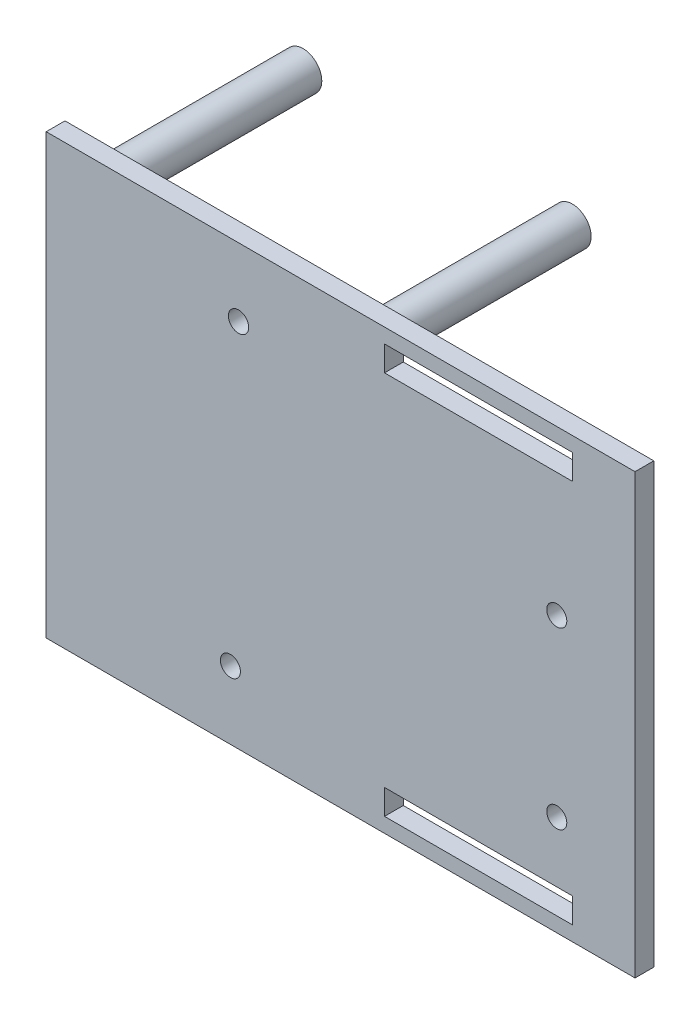
ISO-10303-21;
HEADER;
FILE_DESCRIPTION(('STEP AP214'),'2;1');
FILE_NAME('part.step','',(''),(''),'','','');
FILE_SCHEMA(('AUTOMOTIVE_DESIGN { 1 0 10303 214 1 1 1 1 }'));
ENDSEC;
DATA;
#1=APPLICATION_CONTEXT('core data for automotive mechanical design processes');
#2=APPLICATION_PROTOCOL_DEFINITION('international standard','automotive_design',2000,#1);
#3=PRODUCT_CONTEXT('',#1,'mechanical');
#4=PRODUCT('Part','Part','',(#3));
#5=PRODUCT_RELATED_PRODUCT_CATEGORY('part','',(#4));
#6=PRODUCT_DEFINITION_FORMATION('','',#4);
#7=PRODUCT_DEFINITION_CONTEXT('part definition',#1,'design');
#8=PRODUCT_DEFINITION('design','',#6,#7);
#9=PRODUCT_DEFINITION_SHAPE('','',#8);
#10=(LENGTH_UNIT() NAMED_UNIT(*) SI_UNIT(.MILLI.,.METRE.));
#11=(NAMED_UNIT(*) PLANE_ANGLE_UNIT() SI_UNIT($,.RADIAN.));
#12=(NAMED_UNIT(*) SI_UNIT($,.STERADIAN.) SOLID_ANGLE_UNIT());
#13=UNCERTAINTY_MEASURE_WITH_UNIT(LENGTH_MEASURE(1.E-05),#10,'distance_accuracy_value','');
#14=(GEOMETRIC_REPRESENTATION_CONTEXT(3) GLOBAL_UNCERTAINTY_ASSIGNED_CONTEXT((#13)) GLOBAL_UNIT_ASSIGNED_CONTEXT((#10,
#11,#12)) REPRESENTATION_CONTEXT('',''));
#15=CARTESIAN_POINT('',(0.,0.,0.));
#16=DIRECTION('',(0.,0.,1.));
#17=DIRECTION('',(1.,0.,0.));
#18=AXIS2_PLACEMENT_3D('',#15,#16,#17);
#19=CARTESIAN_POINT('',(0.,0.,3.));
#20=DIRECTION('',(1.,0.,0.));
#21=DIRECTION('',(0.,0.,-1.));
#22=AXIS2_PLACEMENT_3D('',#19,#20,#21);
#23=PLANE('',#22);
#24=DIRECTION('',(0.,-1.,0.));
#25=VECTOR('',#24,1.);
#26=CARTESIAN_POINT('',(0.,0.,0.));
#27=LINE('',#26,#25);
#28=CARTESIAN_POINT('',(0.,70.,0.));
#29=VERTEX_POINT('',#28);
#30=CARTESIAN_POINT('',(0.,0.,0.));
#31=VERTEX_POINT('',#30);
#32=EDGE_CURVE('E211',#29,#31,#27,.T.);
#33=ORIENTED_EDGE('',*,*,#32,.T.);
#34=DIRECTION('',(0.,0.,-1.));
#35=VECTOR('',#34,1.);
#36=CARTESIAN_POINT('',(0.,0.,3.));
#37=LINE('',#36,#35);
#38=CARTESIAN_POINT('',(0.,0.,3.));
#39=VERTEX_POINT('',#38);
#40=EDGE_CURVE('E238',#39,#31,#37,.T.);
#41=ORIENTED_EDGE('',*,*,#40,.F.);
#42=DIRECTION('',(0.,-1.,0.));
#43=VECTOR('',#42,1.);
#44=CARTESIAN_POINT('',(0.,0.,3.));
#45=LINE('',#44,#43);
#46=CARTESIAN_POINT('',(0.,70.,3.));
#47=VERTEX_POINT('',#46);
#48=EDGE_CURVE('E212',#47,#39,#45,.T.);
#49=ORIENTED_EDGE('',*,*,#48,.F.);
#50=DIRECTION('',(0.,0.,-1.));
#51=VECTOR('',#50,1.);
#52=CARTESIAN_POINT('',(0.,70.,3.));
#53=LINE('',#52,#51);
#54=EDGE_CURVE('E222',#47,#29,#53,.T.);
#55=ORIENTED_EDGE('',*,*,#54,.T.);
#56=EDGE_LOOP('',(#33,#41,#49,#55));
#57=FACE_BOUND('',#56,.T.);
#58=ADVANCED_FACE('F32',(#57),#23,.F.);
#59=CARTESIAN_POINT('',(0.,0.,3.));
#60=DIRECTION('',(0.,1.,0.));
#61=DIRECTION('',(0.,0.,1.));
#62=AXIS2_PLACEMENT_3D('',#59,#60,#61);
#63=PLANE('',#62);
#64=DIRECTION('',(1.,0.,0.));
#65=VECTOR('',#64,1.);
#66=CARTESIAN_POINT('',(0.,0.,0.));
#67=LINE('',#66,#65);
#68=CARTESIAN_POINT('',(94.,0.,0.));
#69=VERTEX_POINT('',#68);
#70=EDGE_CURVE('E225',#31,#69,#67,.T.);
#71=ORIENTED_EDGE('',*,*,#70,.T.);
#72=DIRECTION('',(0.,0.,-1.));
#73=VECTOR('',#72,1.);
#74=CARTESIAN_POINT('',(94.,0.,3.));
#75=LINE('',#74,#73);
#76=CARTESIAN_POINT('',(94.,0.,3.));
#77=VERTEX_POINT('',#76);
#78=EDGE_CURVE('E235',#77,#69,#75,.T.);
#79=ORIENTED_EDGE('',*,*,#78,.F.);
#80=DIRECTION('',(1.,0.,0.));
#81=VECTOR('',#80,1.);
#82=CARTESIAN_POINT('',(0.,0.,3.));
#83=LINE('',#82,#81);
#84=EDGE_CURVE('E215',#39,#77,#83,.T.);
#85=ORIENTED_EDGE('',*,*,#84,.F.);
#86=ORIENTED_EDGE('',*,*,#40,.T.);
#87=EDGE_LOOP('',(#71,#79,#85,#86));
#88=FACE_BOUND('',#87,.T.);
#89=ADVANCED_FACE('F295',(#88),#63,.F.);
#90=CARTESIAN_POINT('',(94.,0.,3.));
#91=DIRECTION('',(-1.,0.,0.));
#92=DIRECTION('',(0.,0.,1.));
#93=AXIS2_PLACEMENT_3D('',#90,#91,#92);
#94=PLANE('',#93);
#95=DIRECTION('',(0.,1.,0.));
#96=VECTOR('',#95,1.);
#97=CARTESIAN_POINT('',(94.,0.,0.));
#98=LINE('',#97,#96);
#99=CARTESIAN_POINT('',(94.,70.,0.));
#100=VERTEX_POINT('',#99);
#101=EDGE_CURVE('E227',#69,#100,#98,.T.);
#102=ORIENTED_EDGE('',*,*,#101,.T.);
#103=DIRECTION('',(0.,0.,-1.));
#104=VECTOR('',#103,1.);
#105=CARTESIAN_POINT('',(94.,70.,3.));
#106=LINE('',#105,#104);
#107=CARTESIAN_POINT('',(94.,70.,3.));
#108=VERTEX_POINT('',#107);
#109=EDGE_CURVE('E232',#108,#100,#106,.T.);
#110=ORIENTED_EDGE('',*,*,#109,.F.);
#111=DIRECTION('',(0.,1.,0.));
#112=VECTOR('',#111,1.);
#113=CARTESIAN_POINT('',(94.,0.,3.));
#114=LINE('',#113,#112);
#115=EDGE_CURVE('E218',#77,#108,#114,.T.);
#116=ORIENTED_EDGE('',*,*,#115,.F.);
#117=ORIENTED_EDGE('',*,*,#78,.T.);
#118=EDGE_LOOP('',(#102,#110,#116,#117));
#119=FACE_BOUND('',#118,.T.);
#120=ADVANCED_FACE('F300',(#119),#94,.F.);
#121=CARTESIAN_POINT('',(0.,70.,3.));
#122=DIRECTION('',(0.,-1.,0.));
#123=DIRECTION('',(0.,0.,-1.));
#124=AXIS2_PLACEMENT_3D('',#121,#122,#123);
#125=PLANE('',#124);
#126=DIRECTION('',(-1.,0.,0.));
#127=VECTOR('',#126,1.);
#128=CARTESIAN_POINT('',(0.,70.,0.));
#129=LINE('',#128,#127);
#130=EDGE_CURVE('E216',#100,#29,#129,.T.);
#131=ORIENTED_EDGE('',*,*,#130,.T.);
#132=ORIENTED_EDGE('',*,*,#54,.F.);
#133=DIRECTION('',(-1.,0.,0.));
#134=VECTOR('',#133,1.);
#135=CARTESIAN_POINT('',(0.,70.,3.));
#136=LINE('',#135,#134);
#137=EDGE_CURVE('E220',#108,#47,#136,.T.);
#138=ORIENTED_EDGE('',*,*,#137,.F.);
#139=ORIENTED_EDGE('',*,*,#109,.T.);
#140=EDGE_LOOP('',(#131,#132,#138,#139));
#141=FACE_BOUND('',#140,.T.);
#142=ADVANCED_FACE('F315',(#141),#125,.F.);
#143=CARTESIAN_POINT('',(0.,0.,3.));
#144=DIRECTION('',(0.,0.,-1.));
#145=DIRECTION('',(-1.,0.,0.));
#146=AXIS2_PLACEMENT_3D('',#143,#144,#145);
#147=PLANE('',#146);
#148=DIRECTION('',(0.,-1.,0.));
#149=VECTOR('',#148,1.);
#150=CARTESIAN_POINT('',(54.0082035372518,0.,3.));
#151=LINE('',#150,#149);
#152=CARTESIAN_POINT('',(54.0082035372518,67.6658056264682,3.));
#153=VERTEX_POINT('',#152);
#154=CARTESIAN_POINT('',(54.0082035372518,63.6658056264682,3.));
#155=VERTEX_POINT('',#154);
#156=EDGE_CURVE('E136',#153,#155,#151,.T.);
#157=ORIENTED_EDGE('',*,*,#156,.F.);
#158=DIRECTION('',(-1.,0.,0.));
#159=VECTOR('',#158,1.);
#160=CARTESIAN_POINT('',(0.,67.6658056264682,3.));
#161=LINE('',#160,#159);
#162=CARTESIAN_POINT('',(84.0082035372518,67.6658056264682,3.));
#163=VERTEX_POINT('',#162);
#164=EDGE_CURVE('E46',#163,#153,#161,.T.);
#165=ORIENTED_EDGE('',*,*,#164,.F.);
#166=DIRECTION('',(0.,1.,0.));
#167=VECTOR('',#166,1.);
#168=CARTESIAN_POINT('',(84.0082035372518,0.,3.));
#169=LINE('',#168,#167);
#170=CARTESIAN_POINT('',(84.0082035372518,63.6658056264682,3.));
#171=VERTEX_POINT('',#170);
#172=EDGE_CURVE('E143',#171,#163,#169,.T.);
#173=ORIENTED_EDGE('',*,*,#172,.F.);
#174=DIRECTION('',(-1.,0.,0.));
#175=VECTOR('',#174,1.);
#176=CARTESIAN_POINT('',(0.,63.6658056264682,3.));
#177=LINE('',#176,#175);
#178=EDGE_CURVE('E126',#171,#155,#177,.T.);
#179=ORIENTED_EDGE('',*,*,#178,.T.);
#180=EDGE_LOOP('',(#157,#165,#173,#179));
#181=FACE_BOUND('',#180,.T.);
#182=DIRECTION('',(0.,-1.,0.));
#183=VECTOR('',#182,1.);
#184=CARTESIAN_POINT('',(54.0082035372518,1.87378597142809E-13,3.));
#185=LINE('',#184,#183);
#186=CARTESIAN_POINT('',(54.0082035372518,6.35000000000001,3.));
#187=VERTEX_POINT('',#186);
#188=CARTESIAN_POINT('',(54.0082035372518,2.35000000000001,3.));
#189=VERTEX_POINT('',#188);
#190=EDGE_CURVE('E168',#187,#189,#185,.T.);
#191=ORIENTED_EDGE('',*,*,#190,.F.);
#192=DIRECTION('',(-1.,0.,0.));
#193=VECTOR('',#192,1.);
#194=CARTESIAN_POINT('',(0.,6.35000000000001,3.));
#195=LINE('',#194,#193);
#196=CARTESIAN_POINT('',(84.0082035372518,6.35000000000001,3.));
#197=VERTEX_POINT('',#196);
#198=EDGE_CURVE('E54',#197,#187,#195,.T.);
#199=ORIENTED_EDGE('',*,*,#198,.F.);
#200=DIRECTION('',(0.,-1.,0.));
#201=VECTOR('',#200,1.);
#202=CARTESIAN_POINT('',(84.0082035372518,2.91462005701417E-13,3.));
#203=LINE('',#202,#201);
#204=CARTESIAN_POINT('',(84.0082035372518,2.35000000000001,3.));
#205=VERTEX_POINT('',#204);
#206=EDGE_CURVE('E155',#197,#205,#203,.T.);
#207=ORIENTED_EDGE('',*,*,#206,.T.);
#208=DIRECTION('',(-1.,0.,0.));
#209=VECTOR('',#208,1.);
#210=CARTESIAN_POINT('',(0.,2.35000000000001,3.));
#211=LINE('',#210,#209);
#212=EDGE_CURVE('E165',#205,#189,#211,.T.);
#213=ORIENTED_EDGE('',*,*,#212,.T.);
#214=EDGE_LOOP('',(#191,#199,#207,#213));
#215=FACE_BOUND('',#214,.T.);
#216=CARTESIAN_POINT('',(29.4082035372501,10.85,3.));
#217=DIRECTION('',(0.,0.,1.));
#218=DIRECTION('',(1.,0.,0.));
#219=AXIS2_PLACEMENT_3D('',#216,#217,#218);
#220=CIRCLE('',#219,1.6);
#221=CARTESIAN_POINT('',(31.0082035372501,10.85,3.));
#222=VERTEX_POINT('',#221);
#223=EDGE_CURVE('E162',#222,#222,#220,.T.);
#224=ORIENTED_EDGE('',*,*,#223,.F.);
#225=EDGE_LOOP('',(#224));
#226=FACE_BOUND('',#225,.T.);
#227=CARTESIAN_POINT('',(81.5082035372501,15.9981645168826,3.));
#228=DIRECTION('',(0.,0.,1.));
#229=DIRECTION('',(1.,0.,0.));
#230=AXIS2_PLACEMENT_3D('',#227,#228,#229);
#231=CIRCLE('',#230,1.6);
#232=CARTESIAN_POINT('',(83.1082035372501,15.9981645168826,3.));
#233=VERTEX_POINT('',#232);
#234=EDGE_CURVE('E174',#233,#233,#231,.T.);
#235=ORIENTED_EDGE('',*,*,#234,.F.);
#236=EDGE_LOOP('',(#235));
#237=FACE_BOUND('',#236,.T.);
#238=CARTESIAN_POINT('',(81.50820353725,43.9,3.));
#239=DIRECTION('',(0.,0.,1.));
#240=DIRECTION('',(1.,0.,0.));
#241=AXIS2_PLACEMENT_3D('',#238,#239,#240);
#242=CIRCLE('',#241,1.60000000000001);
#243=CARTESIAN_POINT('',(83.10820353725,43.9,3.));
#244=VERTEX_POINT('',#243);
#245=EDGE_CURVE('E177',#244,#244,#242,.T.);
#246=ORIENTED_EDGE('',*,*,#245,.F.);
#247=EDGE_LOOP('',(#246));
#248=FACE_BOUND('',#247,.T.);
#249=CARTESIAN_POINT('',(30.70820353725,59.1,3.));
#250=DIRECTION('',(0.,0.,1.));
#251=DIRECTION('',(1.,0.,0.));
#252=AXIS2_PLACEMENT_3D('',#249,#250,#251);
#253=CIRCLE('',#252,1.61924476262096);
#254=CARTESIAN_POINT('',(32.327448299871,59.1,3.));
#255=VERTEX_POINT('',#254);
#256=EDGE_CURVE('E180',#255,#255,#253,.T.);
#257=ORIENTED_EDGE('',*,*,#256,.F.);
#258=EDGE_LOOP('',(#257));
#259=FACE_BOUND('',#258,.T.);
#260=ORIENTED_EDGE('',*,*,#48,.T.);
#261=ORIENTED_EDGE('',*,*,#84,.T.);
#262=ORIENTED_EDGE('',*,*,#115,.T.);
#263=ORIENTED_EDGE('',*,*,#137,.T.);
#264=EDGE_LOOP('',(#260,#261,#262,#263));
#265=FACE_BOUND('',#264,.T.);
#266=ADVANCED_FACE('F140',(#181,#215,#226,#237,#248,#259,#265),#147,.F.);
#267=CARTESIAN_POINT('',(0.,0.,0.));
#268=DIRECTION('',(0.,0.,-1.));
#269=DIRECTION('',(-1.,0.,0.));
#270=AXIS2_PLACEMENT_3D('',#267,#268,#269);
#271=PLANE('',#270);
#272=DIRECTION('',(1.,0.,0.));
#273=VECTOR('',#272,1.);
#274=CARTESIAN_POINT('',(0.,67.6658056264682,0.));
#275=LINE('',#274,#273);
#276=CARTESIAN_POINT('',(54.0082035372518,67.6658056264682,0.));
#277=VERTEX_POINT('',#276);
#278=CARTESIAN_POINT('',(84.0082035372518,67.6658056264682,0.));
#279=VERTEX_POINT('',#278);
#280=EDGE_CURVE('E11',#277,#279,#275,.T.);
#281=ORIENTED_EDGE('',*,*,#280,.F.);
#282=DIRECTION('',(0.,1.,0.));
#283=VECTOR('',#282,1.);
#284=CARTESIAN_POINT('',(54.0082035372518,0.,0.));
#285=LINE('',#284,#283);
#286=CARTESIAN_POINT('',(54.0082035372518,63.6658056264682,0.));
#287=VERTEX_POINT('',#286);
#288=EDGE_CURVE('E270',#287,#277,#285,.T.);
#289=ORIENTED_EDGE('',*,*,#288,.F.);
#290=DIRECTION('',(1.,0.,0.));
#291=VECTOR('',#290,1.);
#292=CARTESIAN_POINT('',(0.,63.6658056264682,0.));
#293=LINE('',#292,#291);
#294=CARTESIAN_POINT('',(84.0082035372518,63.6658056264682,0.));
#295=VERTEX_POINT('',#294);
#296=EDGE_CURVE('E129',#287,#295,#293,.T.);
#297=ORIENTED_EDGE('',*,*,#296,.T.);
#298=DIRECTION('',(0.,-1.,0.));
#299=VECTOR('',#298,1.);
#300=CARTESIAN_POINT('',(84.0082035372518,0.,0.));
#301=LINE('',#300,#299);
#302=EDGE_CURVE('E39',#279,#295,#301,.T.);
#303=ORIENTED_EDGE('',*,*,#302,.F.);
#304=EDGE_LOOP('',(#281,#289,#297,#303));
#305=FACE_BOUND('',#304,.T.);
#306=DIRECTION('',(1.,0.,0.));
#307=VECTOR('',#306,1.);
#308=CARTESIAN_POINT('',(0.,6.35000000000001,0.));
#309=LINE('',#308,#307);
#310=CARTESIAN_POINT('',(54.0082035372518,6.35000000000001,0.));
#311=VERTEX_POINT('',#310);
#312=CARTESIAN_POINT('',(84.0082035372518,6.35000000000001,0.));
#313=VERTEX_POINT('',#312);
#314=EDGE_CURVE('E268',#311,#313,#309,.T.);
#315=ORIENTED_EDGE('',*,*,#314,.F.);
#316=DIRECTION('',(0.,1.,0.));
#317=VECTOR('',#316,1.);
#318=CARTESIAN_POINT('',(54.0082035372518,1.87378597142809E-13,0.));
#319=LINE('',#318,#317);
#320=CARTESIAN_POINT('',(54.0082035372518,2.35000000000001,0.));
#321=VERTEX_POINT('',#320);
#322=EDGE_CURVE('E250',#321,#311,#319,.T.);
#323=ORIENTED_EDGE('',*,*,#322,.F.);
#324=DIRECTION('',(1.,0.,0.));
#325=VECTOR('',#324,1.);
#326=CARTESIAN_POINT('',(0.,2.35000000000001,0.));
#327=LINE('',#326,#325);
#328=CARTESIAN_POINT('',(84.0082035372518,2.35000000000001,0.));
#329=VERTEX_POINT('',#328);
#330=EDGE_CURVE('E262',#321,#329,#327,.T.);
#331=ORIENTED_EDGE('',*,*,#330,.T.);
#332=DIRECTION('',(0.,1.,0.));
#333=VECTOR('',#332,1.);
#334=CARTESIAN_POINT('',(84.0082035372518,2.91462005701417E-13,0.));
#335=LINE('',#334,#333);
#336=EDGE_CURVE('E265',#329,#313,#335,.T.);
#337=ORIENTED_EDGE('',*,*,#336,.T.);
#338=EDGE_LOOP('',(#315,#323,#331,#337));
#339=FACE_BOUND('',#338,.T.);
#340=CARTESIAN_POINT('',(29.4082035372501,10.85,0.));
#341=DIRECTION('',(0.,0.,-1.));
#342=DIRECTION('',(-1.,0.,0.));
#343=AXIS2_PLACEMENT_3D('',#340,#341,#342);
#344=CIRCLE('',#343,1.6);
#345=CARTESIAN_POINT('',(27.8082035372501,10.85,0.));
#346=VERTEX_POINT('',#345);
#347=EDGE_CURVE('E190',#346,#346,#344,.T.);
#348=ORIENTED_EDGE('',*,*,#347,.F.);
#349=EDGE_LOOP('',(#348));
#350=FACE_BOUND('',#349,.T.);
#351=CARTESIAN_POINT('',(81.5082035372501,15.9981645168826,0.));
#352=DIRECTION('',(0.,0.,-1.));
#353=DIRECTION('',(-1.,0.,0.));
#354=AXIS2_PLACEMENT_3D('',#351,#352,#353);
#355=CIRCLE('',#354,1.6);
#356=CARTESIAN_POINT('',(79.9082035372501,15.9981645168826,0.));
#357=VERTEX_POINT('',#356);
#358=EDGE_CURVE('E256',#357,#357,#355,.T.);
#359=ORIENTED_EDGE('',*,*,#358,.F.);
#360=EDGE_LOOP('',(#359));
#361=FACE_BOUND('',#360,.T.);
#362=CARTESIAN_POINT('',(81.50820353725,43.9,0.));
#363=DIRECTION('',(0.,0.,-1.));
#364=DIRECTION('',(-1.,0.,0.));
#365=AXIS2_PLACEMENT_3D('',#362,#363,#364);
#366=CIRCLE('',#365,1.60000000000001);
#367=CARTESIAN_POINT('',(79.90820353725,43.9,0.));
#368=VERTEX_POINT('',#367);
#369=EDGE_CURVE('E253',#368,#368,#366,.T.);
#370=ORIENTED_EDGE('',*,*,#369,.F.);
#371=EDGE_LOOP('',(#370));
#372=FACE_BOUND('',#371,.T.);
#373=CARTESIAN_POINT('',(30.70820353725,59.1,0.));
#374=DIRECTION('',(0.,0.,-1.));
#375=DIRECTION('',(-1.,0.,0.));
#376=AXIS2_PLACEMENT_3D('',#373,#374,#375);
#377=CIRCLE('',#376,1.61924476262096);
#378=CARTESIAN_POINT('',(29.0889587746291,59.1,0.));
#379=VERTEX_POINT('',#378);
#380=EDGE_CURVE('E150',#379,#379,#377,.T.);
#381=ORIENTED_EDGE('',*,*,#380,.F.);
#382=EDGE_LOOP('',(#381));
#383=FACE_BOUND('',#382,.T.);
#384=CARTESIAN_POINT('',(6.00000000000001,64.,0.));
#385=DIRECTION('',(0.,0.,-1.));
#386=DIRECTION('',(-1.,0.,0.));
#387=AXIS2_PLACEMENT_3D('',#384,#385,#386);
#388=CIRCLE('',#387,3.);
#389=CARTESIAN_POINT('',(3.00000000000001,64.,0.));
#390=VERTEX_POINT('',#389);
#391=EDGE_CURVE('E247',#390,#390,#388,.T.);
#392=ORIENTED_EDGE('',*,*,#391,.F.);
#393=EDGE_LOOP('',(#392));
#394=FACE_BOUND('',#393,.T.);
#395=CARTESIAN_POINT('',(49.,64.,0.));
#396=DIRECTION('',(0.,0.,-1.));
#397=DIRECTION('',(-1.,0.,0.));
#398=AXIS2_PLACEMENT_3D('',#395,#396,#397);
#399=CIRCLE('',#398,3.);
#400=CARTESIAN_POINT('',(46.,64.,0.));
#401=VERTEX_POINT('',#400);
#402=EDGE_CURVE('E244',#401,#401,#399,.T.);
#403=ORIENTED_EDGE('',*,*,#402,.F.);
#404=EDGE_LOOP('',(#403));
#405=FACE_BOUND('',#404,.T.);
#406=CARTESIAN_POINT('',(49.,5.99999999999999,0.));
#407=DIRECTION('',(0.,0.,-1.));
#408=DIRECTION('',(-1.,0.,0.));
#409=AXIS2_PLACEMENT_3D('',#406,#407,#408);
#410=CIRCLE('',#409,3.);
#411=CARTESIAN_POINT('',(46.,5.99999999999999,0.));
#412=VERTEX_POINT('',#411);
#413=EDGE_CURVE('E241',#412,#412,#410,.T.);
#414=ORIENTED_EDGE('',*,*,#413,.F.);
#415=EDGE_LOOP('',(#414));
#416=FACE_BOUND('',#415,.T.);
#417=ORIENTED_EDGE('',*,*,#32,.F.);
#418=ORIENTED_EDGE('',*,*,#130,.F.);
#419=ORIENTED_EDGE('',*,*,#101,.F.);
#420=ORIENTED_EDGE('',*,*,#70,.F.);
#421=EDGE_LOOP('',(#417,#418,#419,#420));
#422=FACE_BOUND('',#421,.T.);
#423=ADVANCED_FACE('F278',(#305,#339,#350,#361,#372,#383,#394,#405,#416,#422),#271,.T.);
#424=CARTESIAN_POINT('',(49.,5.99999999999999,-32.));
#425=DIRECTION('',(0.,0.,1.));
#426=DIRECTION('',(1.,0.,0.));
#427=AXIS2_PLACEMENT_3D('',#424,#425,#426);
#428=CYLINDRICAL_SURFACE('',#427,3.);
#429=ORIENTED_EDGE('',*,*,#413,.T.);
#430=EDGE_LOOP('',(#429));
#431=FACE_BOUND('',#430,.T.);
#432=CARTESIAN_POINT('',(49.,5.99999999999999,-32.));
#433=DIRECTION('',(0.,0.,1.));
#434=DIRECTION('',(1.,0.,0.));
#435=AXIS2_PLACEMENT_3D('',#432,#433,#434);
#436=CIRCLE('',#435,3.);
#437=CARTESIAN_POINT('',(52.,5.99999999999999,-32.));
#438=VERTEX_POINT('',#437);
#439=EDGE_CURVE('E208',#438,#438,#436,.T.);
#440=ORIENTED_EDGE('',*,*,#439,.T.);
#441=EDGE_LOOP('',(#440));
#442=FACE_BOUND('',#441,.T.);
#443=ADVANCED_FACE('F326',(#431,#442),#428,.T.);
#444=CARTESIAN_POINT('',(49.,5.99999999999999,-32.));
#445=DIRECTION('',(0.,0.,1.));
#446=DIRECTION('',(1.,0.,0.));
#447=AXIS2_PLACEMENT_3D('',#444,#445,#446);
#448=PLANE('',#447);
#449=CARTESIAN_POINT('',(49.,5.99999999999999,-32.));
#450=DIRECTION('',(0.,0.,-1.));
#451=DIRECTION('',(-1.,0.,0.));
#452=AXIS2_PLACEMENT_3D('',#449,#450,#451);
#453=CIRCLE('',#452,1.6026276289191);
#454=CARTESIAN_POINT('',(47.3973723710809,5.99999999999999,-32.));
#455=VERTEX_POINT('',#454);
#456=EDGE_CURVE('E194',#455,#455,#453,.T.);
#457=ORIENTED_EDGE('',*,*,#456,.F.);
#458=EDGE_LOOP('',(#457));
#459=FACE_BOUND('',#458,.T.);
#460=ORIENTED_EDGE('',*,*,#439,.F.);
#461=EDGE_LOOP('',(#460));
#462=FACE_BOUND('',#461,.T.);
#463=ADVANCED_FACE('F331',(#459,#462),#448,.F.);
#464=CARTESIAN_POINT('',(49.,64.,-32.));
#465=DIRECTION('',(0.,0.,1.));
#466=DIRECTION('',(1.,0.,0.));
#467=AXIS2_PLACEMENT_3D('',#464,#465,#466);
#468=CYLINDRICAL_SURFACE('',#467,3.);
#469=ORIENTED_EDGE('',*,*,#402,.T.);
#470=EDGE_LOOP('',(#469));
#471=FACE_BOUND('',#470,.T.);
#472=CARTESIAN_POINT('',(49.,64.,-32.));
#473=DIRECTION('',(0.,0.,1.));
#474=DIRECTION('',(1.,0.,0.));
#475=AXIS2_PLACEMENT_3D('',#472,#473,#474);
#476=CIRCLE('',#475,3.);
#477=CARTESIAN_POINT('',(52.,64.,-32.));
#478=VERTEX_POINT('',#477);
#479=EDGE_CURVE('E205',#478,#478,#476,.T.);
#480=ORIENTED_EDGE('',*,*,#479,.T.);
#481=EDGE_LOOP('',(#480));
#482=FACE_BOUND('',#481,.T.);
#483=ADVANCED_FACE('F335',(#471,#482),#468,.T.);
#484=CARTESIAN_POINT('',(49.,64.,-32.));
#485=DIRECTION('',(0.,0.,1.));
#486=DIRECTION('',(1.,0.,0.));
#487=AXIS2_PLACEMENT_3D('',#484,#485,#486);
#488=PLANE('',#487);
#489=CARTESIAN_POINT('',(49.,64.,-32.));
#490=DIRECTION('',(0.,0.,-1.));
#491=DIRECTION('',(-1.,0.,0.));
#492=AXIS2_PLACEMENT_3D('',#489,#490,#491);
#493=CIRCLE('',#492,1.6);
#494=CARTESIAN_POINT('',(47.4,64.,-32.));
#495=VERTEX_POINT('',#494);
#496=EDGE_CURVE('E187',#495,#495,#493,.T.);
#497=ORIENTED_EDGE('',*,*,#496,.F.);
#498=EDGE_LOOP('',(#497));
#499=FACE_BOUND('',#498,.T.);
#500=ORIENTED_EDGE('',*,*,#479,.F.);
#501=EDGE_LOOP('',(#500));
#502=FACE_BOUND('',#501,.T.);
#503=ADVANCED_FACE('F339',(#499,#502),#488,.F.);
#504=CARTESIAN_POINT('',(6.00000000000001,64.,-32.));
#505=DIRECTION('',(0.,0.,1.));
#506=DIRECTION('',(1.,0.,0.));
#507=AXIS2_PLACEMENT_3D('',#504,#505,#506);
#508=CYLINDRICAL_SURFACE('',#507,3.);
#509=ORIENTED_EDGE('',*,*,#391,.T.);
#510=EDGE_LOOP('',(#509));
#511=FACE_BOUND('',#510,.T.);
#512=CARTESIAN_POINT('',(6.00000000000001,64.,-32.));
#513=DIRECTION('',(0.,0.,1.));
#514=DIRECTION('',(1.,0.,0.));
#515=AXIS2_PLACEMENT_3D('',#512,#513,#514);
#516=CIRCLE('',#515,3.);
#517=CARTESIAN_POINT('',(9.00000000000001,64.,-32.));
#518=VERTEX_POINT('',#517);
#519=EDGE_CURVE('E200',#518,#518,#516,.T.);
#520=ORIENTED_EDGE('',*,*,#519,.T.);
#521=EDGE_LOOP('',(#520));
#522=FACE_BOUND('',#521,.T.);
#523=ADVANCED_FACE('F343',(#511,#522),#508,.T.);
#524=CARTESIAN_POINT('',(6.00000000000001,64.,-32.));
#525=DIRECTION('',(0.,0.,1.));
#526=DIRECTION('',(1.,0.,0.));
#527=AXIS2_PLACEMENT_3D('',#524,#525,#526);
#528=PLANE('',#527);
#529=CARTESIAN_POINT('',(6.00000000000001,64.,-32.));
#530=DIRECTION('',(0.,0.,-1.));
#531=DIRECTION('',(-1.,0.,0.));
#532=AXIS2_PLACEMENT_3D('',#529,#530,#531);
#533=CIRCLE('',#532,1.6);
#534=CARTESIAN_POINT('',(4.4,64.,-32.));
#535=VERTEX_POINT('',#534);
#536=EDGE_CURVE('E186',#535,#535,#533,.T.);
#537=ORIENTED_EDGE('',*,*,#536,.F.);
#538=EDGE_LOOP('',(#537));
#539=FACE_BOUND('',#538,.T.);
#540=ORIENTED_EDGE('',*,*,#519,.F.);
#541=EDGE_LOOP('',(#540));
#542=FACE_BOUND('',#541,.T.);
#543=ADVANCED_FACE('F347',(#539,#542),#528,.F.);
#544=CARTESIAN_POINT('',(49.,5.99999999999999,-27.));
#545=DIRECTION('',(0.,0.,-1.));
#546=DIRECTION('',(-1.,0.,0.));
#547=AXIS2_PLACEMENT_3D('',#544,#545,#546);
#548=CYLINDRICAL_SURFACE('',#547,1.6026276289191);
#549=CARTESIAN_POINT('',(49.,5.99999999999999,-27.));
#550=DIRECTION('',(0.,0.,-1.));
#551=DIRECTION('',(-1.,0.,0.));
#552=AXIS2_PLACEMENT_3D('',#549,#550,#551);
#553=CIRCLE('',#552,1.6026276289191);
#554=CARTESIAN_POINT('',(47.3973723710809,5.99999999999999,-27.));
#555=VERTEX_POINT('',#554);
#556=EDGE_CURVE('E197',#555,#555,#553,.T.);
#557=ORIENTED_EDGE('',*,*,#556,.F.);
#558=EDGE_LOOP('',(#557));
#559=FACE_BOUND('',#558,.T.);
#560=ORIENTED_EDGE('',*,*,#456,.T.);
#561=EDGE_LOOP('',(#560));
#562=FACE_BOUND('',#561,.T.);
#563=ADVANCED_FACE('F351',(#559,#562),#548,.F.);
#564=CARTESIAN_POINT('',(49.,5.99999999999999,-27.));
#565=DIRECTION('',(0.,0.,-1.));
#566=DIRECTION('',(-1.,0.,0.));
#567=AXIS2_PLACEMENT_3D('',#564,#565,#566);
#568=PLANE('',#567);
#569=ORIENTED_EDGE('',*,*,#556,.T.);
#570=EDGE_LOOP('',(#569));
#571=FACE_BOUND('',#570,.T.);
#572=ADVANCED_FACE('F355',(#571),#568,.T.);
#573=CARTESIAN_POINT('',(6.00000000000001,64.,-27.));
#574=DIRECTION('',(0.,0.,-1.));
#575=DIRECTION('',(-1.,0.,0.));
#576=AXIS2_PLACEMENT_3D('',#573,#574,#575);
#577=CYLINDRICAL_SURFACE('',#576,1.6);
#578=CARTESIAN_POINT('',(6.00000000000001,64.,-27.));
#579=DIRECTION('',(0.,0.,-1.));
#580=DIRECTION('',(-1.,0.,0.));
#581=AXIS2_PLACEMENT_3D('',#578,#579,#580);
#582=CIRCLE('',#581,1.6);
#583=CARTESIAN_POINT('',(4.4,64.,-27.));
#584=VERTEX_POINT('',#583);
#585=EDGE_CURVE('E191',#584,#584,#582,.T.);
#586=ORIENTED_EDGE('',*,*,#585,.F.);
#587=EDGE_LOOP('',(#586));
#588=FACE_BOUND('',#587,.T.);
#589=ORIENTED_EDGE('',*,*,#536,.T.);
#590=EDGE_LOOP('',(#589));
#591=FACE_BOUND('',#590,.T.);
#592=ADVANCED_FACE('F359',(#588,#591),#577,.F.);
#593=CARTESIAN_POINT('',(6.00000000000001,64.,-27.));
#594=DIRECTION('',(0.,0.,-1.));
#595=DIRECTION('',(-1.,0.,0.));
#596=AXIS2_PLACEMENT_3D('',#593,#594,#595);
#597=PLANE('',#596);
#598=ORIENTED_EDGE('',*,*,#585,.T.);
#599=EDGE_LOOP('',(#598));
#600=FACE_BOUND('',#599,.T.);
#601=ADVANCED_FACE('F363',(#600),#597,.T.);
#602=CARTESIAN_POINT('',(49.,64.,-27.));
#603=DIRECTION('',(0.,0.,-1.));
#604=DIRECTION('',(-1.,0.,0.));
#605=AXIS2_PLACEMENT_3D('',#602,#603,#604);
#606=CYLINDRICAL_SURFACE('',#605,1.6);
#607=CARTESIAN_POINT('',(49.,64.,-27.));
#608=DIRECTION('',(0.,0.,-1.));
#609=DIRECTION('',(-1.,0.,0.));
#610=AXIS2_PLACEMENT_3D('',#607,#608,#609);
#611=CIRCLE('',#610,1.6);
#612=CARTESIAN_POINT('',(47.4,64.,-27.));
#613=VERTEX_POINT('',#612);
#614=EDGE_CURVE('E183',#613,#613,#611,.T.);
#615=ORIENTED_EDGE('',*,*,#614,.F.);
#616=EDGE_LOOP('',(#615));
#617=FACE_BOUND('',#616,.T.);
#618=ORIENTED_EDGE('',*,*,#496,.T.);
#619=EDGE_LOOP('',(#618));
#620=FACE_BOUND('',#619,.T.);
#621=ADVANCED_FACE('F367',(#617,#620),#606,.F.);
#622=CARTESIAN_POINT('',(49.,64.,-27.));
#623=DIRECTION('',(0.,0.,-1.));
#624=DIRECTION('',(-1.,0.,0.));
#625=AXIS2_PLACEMENT_3D('',#622,#623,#624);
#626=PLANE('',#625);
#627=ORIENTED_EDGE('',*,*,#614,.T.);
#628=EDGE_LOOP('',(#627));
#629=FACE_BOUND('',#628,.T.);
#630=ADVANCED_FACE('F371',(#629),#626,.T.);
#631=CARTESIAN_POINT('',(30.70820353725,59.1,-2.));
#632=DIRECTION('',(0.,0.,1.));
#633=DIRECTION('',(1.,0.,0.));
#634=AXIS2_PLACEMENT_3D('',#631,#632,#633);
#635=CYLINDRICAL_SURFACE('',#634,1.61924476262096);
#636=ORIENTED_EDGE('',*,*,#380,.T.);
#637=EDGE_LOOP('',(#636));
#638=FACE_BOUND('',#637,.T.);
#639=ORIENTED_EDGE('',*,*,#256,.T.);
#640=EDGE_LOOP('',(#639));
#641=FACE_BOUND('',#640,.T.);
#642=ADVANCED_FACE('F375',(#638,#641),#635,.F.);
#643=CARTESIAN_POINT('',(81.50820353725,43.9,-2.));
#644=DIRECTION('',(0.,0.,1.));
#645=DIRECTION('',(1.,0.,0.));
#646=AXIS2_PLACEMENT_3D('',#643,#644,#645);
#647=CYLINDRICAL_SURFACE('',#646,1.60000000000001);
#648=ORIENTED_EDGE('',*,*,#369,.T.);
#649=EDGE_LOOP('',(#648));
#650=FACE_BOUND('',#649,.T.);
#651=ORIENTED_EDGE('',*,*,#245,.T.);
#652=EDGE_LOOP('',(#651));
#653=FACE_BOUND('',#652,.T.);
#654=ADVANCED_FACE('F379',(#650,#653),#647,.F.);
#655=CARTESIAN_POINT('',(81.5082035372501,15.9981645168826,-2.));
#656=DIRECTION('',(0.,0.,1.));
#657=DIRECTION('',(1.,0.,0.));
#658=AXIS2_PLACEMENT_3D('',#655,#656,#657);
#659=CYLINDRICAL_SURFACE('',#658,1.6);
#660=ORIENTED_EDGE('',*,*,#358,.T.);
#661=EDGE_LOOP('',(#660));
#662=FACE_BOUND('',#661,.T.);
#663=ORIENTED_EDGE('',*,*,#234,.T.);
#664=EDGE_LOOP('',(#663));
#665=FACE_BOUND('',#664,.T.);
#666=ADVANCED_FACE('F383',(#662,#665),#659,.F.);
#667=CARTESIAN_POINT('',(29.4082035372501,10.85,-2.));
#668=DIRECTION('',(0.,0.,1.));
#669=DIRECTION('',(1.,0.,0.));
#670=AXIS2_PLACEMENT_3D('',#667,#668,#669);
#671=CYLINDRICAL_SURFACE('',#670,1.6);
#672=ORIENTED_EDGE('',*,*,#347,.T.);
#673=EDGE_LOOP('',(#672));
#674=FACE_BOUND('',#673,.T.);
#675=ORIENTED_EDGE('',*,*,#223,.T.);
#676=EDGE_LOOP('',(#675));
#677=FACE_BOUND('',#676,.T.);
#678=ADVANCED_FACE('F387',(#674,#677),#671,.F.);
#679=CARTESIAN_POINT('',(0.,6.35000000000001,-2.));
#680=DIRECTION('',(0.,1.,0.));
#681=DIRECTION('',(0.,0.,1.));
#682=AXIS2_PLACEMENT_3D('',#679,#680,#681);
#683=PLANE('',#682);
#684=ORIENTED_EDGE('',*,*,#314,.T.);
#685=DIRECTION('',(0.,0.,1.));
#686=VECTOR('',#685,1.);
#687=CARTESIAN_POINT('',(84.0082035372518,6.35000000000001,-2.));
#688=LINE('',#687,#686);
#689=EDGE_CURVE('E160',#313,#197,#688,.T.);
#690=ORIENTED_EDGE('',*,*,#689,.T.);
#691=ORIENTED_EDGE('',*,*,#198,.T.);
#692=DIRECTION('',(0.,0.,1.));
#693=VECTOR('',#692,1.);
#694=CARTESIAN_POINT('',(54.0082035372518,6.35000000000001,-2.));
#695=LINE('',#694,#693);
#696=EDGE_CURVE('E153',#311,#187,#695,.T.);
#697=ORIENTED_EDGE('',*,*,#696,.F.);
#698=EDGE_LOOP('',(#684,#690,#691,#697));
#699=FACE_BOUND('',#698,.T.);
#700=ADVANCED_FACE('F391',(#699),#683,.F.);
#701=CARTESIAN_POINT('',(84.0082035372518,2.91462005701417E-13,-2.));
#702=DIRECTION('',(-1.,0.,0.));
#703=DIRECTION('',(0.,-1.,0.));
#704=AXIS2_PLACEMENT_3D('',#701,#702,#703);
#705=PLANE('',#704);
#706=DIRECTION('',(0.,0.,1.));
#707=VECTOR('',#706,1.);
#708=CARTESIAN_POINT('',(84.0082035372518,2.35000000000001,-2.));
#709=LINE('',#708,#707);
#710=EDGE_CURVE('E158',#329,#205,#709,.T.);
#711=ORIENTED_EDGE('',*,*,#710,.T.);
#712=ORIENTED_EDGE('',*,*,#206,.F.);
#713=ORIENTED_EDGE('',*,*,#689,.F.);
#714=ORIENTED_EDGE('',*,*,#336,.F.);
#715=EDGE_LOOP('',(#711,#712,#713,#714));
#716=FACE_BOUND('',#715,.T.);
#717=ADVANCED_FACE('F393',(#716),#705,.T.);
#718=CARTESIAN_POINT('',(0.,2.35000000000001,-2.));
#719=DIRECTION('',(0.,1.,0.));
#720=DIRECTION('',(0.,0.,1.));
#721=AXIS2_PLACEMENT_3D('',#718,#719,#720);
#722=PLANE('',#721);
#723=DIRECTION('',(0.,0.,1.));
#724=VECTOR('',#723,1.);
#725=CARTESIAN_POINT('',(54.0082035372518,2.35000000000001,-2.));
#726=LINE('',#725,#724);
#727=EDGE_CURVE('E156',#321,#189,#726,.T.);
#728=ORIENTED_EDGE('',*,*,#727,.T.);
#729=ORIENTED_EDGE('',*,*,#212,.F.);
#730=ORIENTED_EDGE('',*,*,#710,.F.);
#731=ORIENTED_EDGE('',*,*,#330,.F.);
#732=EDGE_LOOP('',(#728,#729,#730,#731));
#733=FACE_BOUND('',#732,.T.);
#734=ADVANCED_FACE('F289',(#733),#722,.T.);
#735=CARTESIAN_POINT('',(54.0082035372518,1.87378597142809E-13,-2.));
#736=DIRECTION('',(-1.,0.,0.));
#737=DIRECTION('',(0.,-1.,0.));
#738=AXIS2_PLACEMENT_3D('',#735,#736,#737);
#739=PLANE('',#738);
#740=ORIENTED_EDGE('',*,*,#322,.T.);
#741=ORIENTED_EDGE('',*,*,#696,.T.);
#742=ORIENTED_EDGE('',*,*,#190,.T.);
#743=ORIENTED_EDGE('',*,*,#727,.F.);
#744=EDGE_LOOP('',(#740,#741,#742,#743));
#745=FACE_BOUND('',#744,.T.);
#746=ADVANCED_FACE('F282',(#745),#739,.F.);
#747=CARTESIAN_POINT('',(0.,67.6658056264682,-2.));
#748=DIRECTION('',(0.,1.,0.));
#749=DIRECTION('',(0.,0.,1.));
#750=AXIS2_PLACEMENT_3D('',#747,#748,#749);
#751=PLANE('',#750);
#752=ORIENTED_EDGE('',*,*,#280,.T.);
#753=DIRECTION('',(0.,0.,1.));
#754=VECTOR('',#753,1.);
#755=CARTESIAN_POINT('',(84.0082035372518,67.6658056264682,-2.));
#756=LINE('',#755,#754);
#757=EDGE_CURVE('E148',#279,#163,#756,.T.);
#758=ORIENTED_EDGE('',*,*,#757,.T.);
#759=ORIENTED_EDGE('',*,*,#164,.T.);
#760=DIRECTION('',(0.,0.,1.));
#761=VECTOR('',#760,1.);
#762=CARTESIAN_POINT('',(54.0082035372518,67.6658056264682,-2.));
#763=LINE('',#762,#761);
#764=EDGE_CURVE('E133',#277,#153,#763,.T.);
#765=ORIENTED_EDGE('',*,*,#764,.F.);
#766=EDGE_LOOP('',(#752,#758,#759,#765));
#767=FACE_BOUND('',#766,.T.);
#768=ADVANCED_FACE('F280',(#767),#751,.F.);
#769=CARTESIAN_POINT('',(84.0082035372518,0.,-2.));
#770=DIRECTION('',(1.,0.,0.));
#771=DIRECTION('',(0.,0.,-1.));
#772=AXIS2_PLACEMENT_3D('',#769,#770,#771);
#773=PLANE('',#772);
#774=ORIENTED_EDGE('',*,*,#302,.T.);
#775=DIRECTION('',(0.,0.,1.));
#776=VECTOR('',#775,1.);
#777=CARTESIAN_POINT('',(84.0082035372518,63.6658056264682,-2.));
#778=LINE('',#777,#776);
#779=EDGE_CURVE('E132',#295,#171,#778,.T.);
#780=ORIENTED_EDGE('',*,*,#779,.T.);
#781=ORIENTED_EDGE('',*,*,#172,.T.);
#782=ORIENTED_EDGE('',*,*,#757,.F.);
#783=EDGE_LOOP('',(#774,#780,#781,#782));
#784=FACE_BOUND('',#783,.T.);
#785=ADVANCED_FACE('F275',(#784),#773,.F.);
#786=CARTESIAN_POINT('',(0.,63.6658056264682,-2.));
#787=DIRECTION('',(0.,1.,0.));
#788=DIRECTION('',(0.,0.,1.));
#789=AXIS2_PLACEMENT_3D('',#786,#787,#788);
#790=PLANE('',#789);
#791=DIRECTION('',(0.,0.,1.));
#792=VECTOR('',#791,1.);
#793=CARTESIAN_POINT('',(54.0082035372518,63.6658056264682,-2.));
#794=LINE('',#793,#792);
#795=EDGE_CURVE('E121',#287,#155,#794,.T.);
#796=ORIENTED_EDGE('',*,*,#795,.T.);
#797=ORIENTED_EDGE('',*,*,#178,.F.);
#798=ORIENTED_EDGE('',*,*,#779,.F.);
#799=ORIENTED_EDGE('',*,*,#296,.F.);
#800=EDGE_LOOP('',(#796,#797,#798,#799));
#801=FACE_BOUND('',#800,.T.);
#802=ADVANCED_FACE('F123',(#801),#790,.T.);
#803=CARTESIAN_POINT('',(54.0082035372518,0.,-2.));
#804=DIRECTION('',(-1.,0.,0.));
#805=DIRECTION('',(0.,0.,1.));
#806=AXIS2_PLACEMENT_3D('',#803,#804,#805);
#807=PLANE('',#806);
#808=ORIENTED_EDGE('',*,*,#288,.T.);
#809=ORIENTED_EDGE('',*,*,#764,.T.);
#810=ORIENTED_EDGE('',*,*,#156,.T.);
#811=ORIENTED_EDGE('',*,*,#795,.F.);
#812=EDGE_LOOP('',(#808,#809,#810,#811));
#813=FACE_BOUND('',#812,.T.);
#814=ADVANCED_FACE('F137',(#813),#807,.F.);
#815=CLOSED_SHELL('',(#58,#89,#120,#142,#266,#423,#443,#463,#483,#503,#523,#543,#563,#572,#592,
#601,#621,#630,#642,#654,#666,#678,#700,#717,#734,#746,#768,#785,#802,#814));
#816=MANIFOLD_SOLID_BREP('B2',#815);
#817=ADVANCED_BREP_SHAPE_REPRESENTATION('',(#18,#816),#14);
#818=SHAPE_DEFINITION_REPRESENTATION(#9,#817);
ENDSEC;
END-ISO-10303-21;
